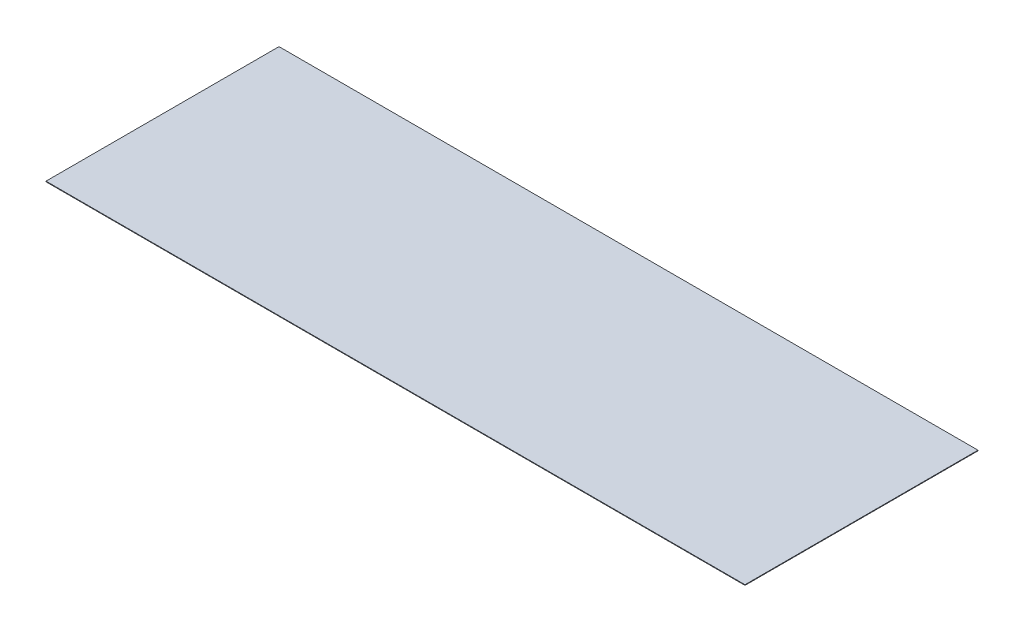
ISO-10303-21;
HEADER;
FILE_DESCRIPTION(('STEP AP214'),'2;1');
FILE_NAME('part.step','',(''),(''),'','','');
FILE_SCHEMA(('AUTOMOTIVE_DESIGN { 1 0 10303 214 1 1 1 1 }'));
ENDSEC;
DATA;
#1=APPLICATION_CONTEXT('core data for automotive mechanical design processes');
#2=APPLICATION_PROTOCOL_DEFINITION('international standard','automotive_design',2000,#1);
#3=PRODUCT_CONTEXT('',#1,'mechanical');
#4=PRODUCT('Part','Part','',(#3));
#5=PRODUCT_RELATED_PRODUCT_CATEGORY('part','',(#4));
#6=PRODUCT_DEFINITION_FORMATION('','',#4);
#7=PRODUCT_DEFINITION_CONTEXT('part definition',#1,'design');
#8=PRODUCT_DEFINITION('design','',#6,#7);
#9=PRODUCT_DEFINITION_SHAPE('','',#8);
#10=(LENGTH_UNIT() NAMED_UNIT(*) SI_UNIT(.MILLI.,.METRE.));
#11=(NAMED_UNIT(*) PLANE_ANGLE_UNIT() SI_UNIT($,.RADIAN.));
#12=(NAMED_UNIT(*) SI_UNIT($,.STERADIAN.) SOLID_ANGLE_UNIT());
#13=UNCERTAINTY_MEASURE_WITH_UNIT(LENGTH_MEASURE(1.E-05),#10,'distance_accuracy_value','');
#14=(GEOMETRIC_REPRESENTATION_CONTEXT(3) GLOBAL_UNCERTAINTY_ASSIGNED_CONTEXT((#13)) GLOBAL_UNIT_ASSIGNED_CONTEXT((#10,
#11,#12)) REPRESENTATION_CONTEXT('',''));
#15=CARTESIAN_POINT('',(0.,0.,0.));
#16=DIRECTION('',(0.,0.,1.));
#17=DIRECTION('',(1.,0.,0.));
#18=AXIS2_PLACEMENT_3D('',#15,#16,#17);
#19=CARTESIAN_POINT('',(0.,0.1,0.));
#20=DIRECTION('',(-1.,0.,0.));
#21=DIRECTION('',(0.,0.,1.));
#22=AXIS2_PLACEMENT_3D('',#19,#20,#21);
#23=PLANE('',#22);
#24=DIRECTION('',(0.,0.,-1.));
#25=VECTOR('',#24,1.);
#26=CARTESIAN_POINT('',(0.,0.,0.));
#27=LINE('',#26,#25);
#28=CARTESIAN_POINT('',(0.,0.,0.));
#29=VERTEX_POINT('',#28);
#30=CARTESIAN_POINT('',(0.,0.,-40.));
#31=VERTEX_POINT('',#30);
#32=EDGE_CURVE('E96',#29,#31,#27,.T.);
#33=ORIENTED_EDGE('',*,*,#32,.T.);
#34=DIRECTION('',(0.,-1.,0.));
#35=VECTOR('',#34,1.);
#36=CARTESIAN_POINT('',(0.,0.1,-40.));
#37=LINE('',#36,#35);
#38=CARTESIAN_POINT('',(0.,0.1,-40.));
#39=VERTEX_POINT('',#38);
#40=EDGE_CURVE('E11',#39,#31,#37,.T.);
#41=ORIENTED_EDGE('',*,*,#40,.F.);
#42=DIRECTION('',(0.,0.,-1.));
#43=VECTOR('',#42,1.);
#44=CARTESIAN_POINT('',(0.,0.1,0.));
#45=LINE('',#44,#43);
#46=CARTESIAN_POINT('',(0.,0.1,0.));
#47=VERTEX_POINT('',#46);
#48=EDGE_CURVE('E84',#47,#39,#45,.T.);
#49=ORIENTED_EDGE('',*,*,#48,.F.);
#50=DIRECTION('',(0.,-1.,0.));
#51=VECTOR('',#50,1.);
#52=CARTESIAN_POINT('',(0.,0.1,0.));
#53=LINE('',#52,#51);
#54=EDGE_CURVE('E92',#47,#29,#53,.T.);
#55=ORIENTED_EDGE('',*,*,#54,.T.);
#56=EDGE_LOOP('',(#33,#41,#49,#55));
#57=FACE_BOUND('',#56,.T.);
#58=ADVANCED_FACE('F33',(#57),#23,.F.);
#59=CARTESIAN_POINT('',(0.,0.1,-40.));
#60=DIRECTION('',(0.,0.,1.));
#61=DIRECTION('',(1.,0.,0.));
#62=AXIS2_PLACEMENT_3D('',#59,#60,#61);
#63=PLANE('',#62);
#64=DIRECTION('',(-1.,0.,0.));
#65=VECTOR('',#64,1.);
#66=CARTESIAN_POINT('',(0.,0.,-40.));
#67=LINE('',#66,#65);
#68=CARTESIAN_POINT('',(-120.,0.,-40.));
#69=VERTEX_POINT('',#68);
#70=EDGE_CURVE('E88',#31,#69,#67,.T.);
#71=ORIENTED_EDGE('',*,*,#70,.T.);
#72=DIRECTION('',(0.,-1.,0.));
#73=VECTOR('',#72,1.);
#74=CARTESIAN_POINT('',(-120.,0.1,-40.));
#75=LINE('',#74,#73);
#76=CARTESIAN_POINT('',(-120.,0.1,-40.));
#77=VERTEX_POINT('',#76);
#78=EDGE_CURVE('E41',#77,#69,#75,.T.);
#79=ORIENTED_EDGE('',*,*,#78,.F.);
#80=DIRECTION('',(-1.,0.,0.));
#81=VECTOR('',#80,1.);
#82=CARTESIAN_POINT('',(0.,0.1,-40.));
#83=LINE('',#82,#81);
#84=EDGE_CURVE('E79',#39,#77,#83,.T.);
#85=ORIENTED_EDGE('',*,*,#84,.F.);
#86=ORIENTED_EDGE('',*,*,#40,.T.);
#87=EDGE_LOOP('',(#71,#79,#85,#86));
#88=FACE_BOUND('',#87,.T.);
#89=ADVANCED_FACE('F87',(#88),#63,.F.);
#90=CARTESIAN_POINT('',(-120.,0.1,0.));
#91=DIRECTION('',(1.,0.,0.));
#92=DIRECTION('',(0.,0.,-1.));
#93=AXIS2_PLACEMENT_3D('',#90,#91,#92);
#94=PLANE('',#93);
#95=DIRECTION('',(0.,0.,1.));
#96=VECTOR('',#95,1.);
#97=CARTESIAN_POINT('',(-120.,0.,0.));
#98=LINE('',#97,#96);
#99=CARTESIAN_POINT('',(-120.,0.,0.));
#100=VERTEX_POINT('',#99);
#101=EDGE_CURVE('E66',#69,#100,#98,.T.);
#102=ORIENTED_EDGE('',*,*,#101,.T.);
#103=DIRECTION('',(0.,-1.,0.));
#104=VECTOR('',#103,1.);
#105=CARTESIAN_POINT('',(-120.,0.1,0.));
#106=LINE('',#105,#104);
#107=CARTESIAN_POINT('',(-120.,0.1,0.));
#108=VERTEX_POINT('',#107);
#109=EDGE_CURVE('E89',#108,#100,#106,.T.);
#110=ORIENTED_EDGE('',*,*,#109,.F.);
#111=DIRECTION('',(0.,0.,1.));
#112=VECTOR('',#111,1.);
#113=CARTESIAN_POINT('',(-120.,0.1,0.));
#114=LINE('',#113,#112);
#115=EDGE_CURVE('E82',#77,#108,#114,.T.);
#116=ORIENTED_EDGE('',*,*,#115,.F.);
#117=ORIENTED_EDGE('',*,*,#78,.T.);
#118=EDGE_LOOP('',(#102,#110,#116,#117));
#119=FACE_BOUND('',#118,.T.);
#120=ADVANCED_FACE('F90',(#119),#94,.F.);
#121=CARTESIAN_POINT('',(0.,0.1,0.));
#122=DIRECTION('',(0.,0.,-1.));
#123=DIRECTION('',(-1.,0.,0.));
#124=AXIS2_PLACEMENT_3D('',#121,#122,#123);
#125=PLANE('',#124);
#126=DIRECTION('',(1.,0.,0.));
#127=VECTOR('',#126,1.);
#128=CARTESIAN_POINT('',(0.,0.,0.));
#129=LINE('',#128,#127);
#130=EDGE_CURVE('E72',#100,#29,#129,.T.);
#131=ORIENTED_EDGE('',*,*,#130,.T.);
#132=ORIENTED_EDGE('',*,*,#54,.F.);
#133=DIRECTION('',(1.,0.,0.));
#134=VECTOR('',#133,1.);
#135=CARTESIAN_POINT('',(0.,0.1,0.));
#136=LINE('',#135,#134);
#137=EDGE_CURVE('E49',#108,#47,#136,.T.);
#138=ORIENTED_EDGE('',*,*,#137,.F.);
#139=ORIENTED_EDGE('',*,*,#109,.T.);
#140=EDGE_LOOP('',(#131,#132,#138,#139));
#141=FACE_BOUND('',#140,.T.);
#142=ADVANCED_FACE('F103',(#141),#125,.F.);
#143=CARTESIAN_POINT('',(0.,0.1,0.));
#144=DIRECTION('',(0.,1.,0.));
#145=DIRECTION('',(0.,0.,1.));
#146=AXIS2_PLACEMENT_3D('',#143,#144,#145);
#147=PLANE('',#146);
#148=ORIENTED_EDGE('',*,*,#48,.T.);
#149=ORIENTED_EDGE('',*,*,#84,.T.);
#150=ORIENTED_EDGE('',*,*,#115,.T.);
#151=ORIENTED_EDGE('',*,*,#137,.T.);
#152=EDGE_LOOP('',(#148,#149,#150,#151));
#153=FACE_BOUND('',#152,.T.);
#154=ADVANCED_FACE('F80',(#153),#147,.T.);
#155=CARTESIAN_POINT('',(0.,0.,0.));
#156=DIRECTION('',(0.,1.,0.));
#157=DIRECTION('',(0.,0.,1.));
#158=AXIS2_PLACEMENT_3D('',#155,#156,#157);
#159=PLANE('',#158);
#160=ORIENTED_EDGE('',*,*,#32,.F.);
#161=ORIENTED_EDGE('',*,*,#130,.F.);
#162=ORIENTED_EDGE('',*,*,#101,.F.);
#163=ORIENTED_EDGE('',*,*,#70,.F.);
#164=EDGE_LOOP('',(#160,#161,#162,#163));
#165=FACE_BOUND('',#164,.T.);
#166=ADVANCED_FACE('F106',(#165),#159,.F.);
#167=CLOSED_SHELL('',(#58,#89,#120,#142,#154,#166));
#168=MANIFOLD_SOLID_BREP('B2',#167);
#169=ADVANCED_BREP_SHAPE_REPRESENTATION('',(#18,#168),#14);
#170=SHAPE_DEFINITION_REPRESENTATION(#9,#169);
ENDSEC;
END-ISO-10303-21;
